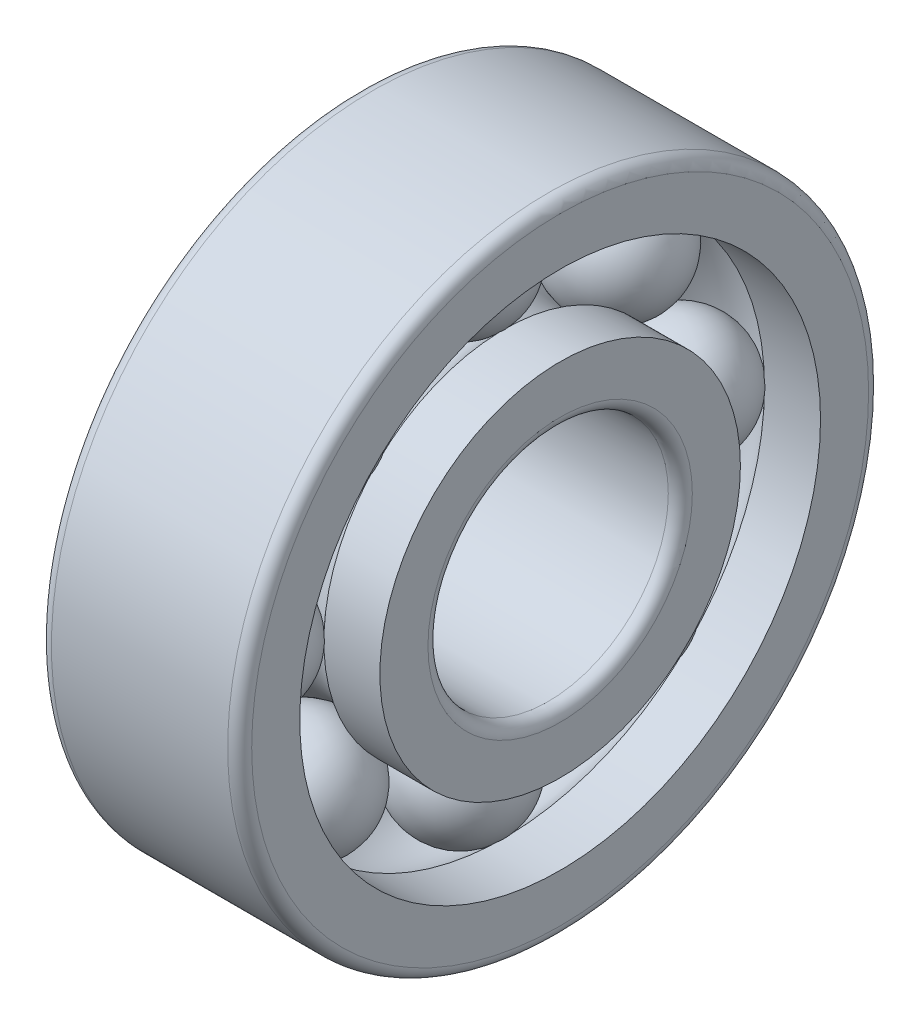
ISO-10303-21;
HEADER;
FILE_DESCRIPTION(('STEP AP214'),'2;1');
FILE_NAME('part.step','',(''),(''),'','','');
FILE_SCHEMA(('AUTOMOTIVE_DESIGN { 1 0 10303 214 1 1 1 1 }'));
ENDSEC;
DATA;
#1=APPLICATION_CONTEXT('core data for automotive mechanical design processes');
#2=APPLICATION_PROTOCOL_DEFINITION('international standard','automotive_design',2000,#1);
#3=PRODUCT_CONTEXT('',#1,'mechanical');
#4=PRODUCT('Part','Part','',(#3));
#5=PRODUCT_RELATED_PRODUCT_CATEGORY('part','',(#4));
#6=PRODUCT_DEFINITION_FORMATION('','',#4);
#7=PRODUCT_DEFINITION_CONTEXT('part definition',#1,'design');
#8=PRODUCT_DEFINITION('design','',#6,#7);
#9=PRODUCT_DEFINITION_SHAPE('','',#8);
#10=(LENGTH_UNIT() NAMED_UNIT(*) SI_UNIT(.MILLI.,.METRE.));
#11=(NAMED_UNIT(*) PLANE_ANGLE_UNIT() SI_UNIT($,.RADIAN.));
#12=(NAMED_UNIT(*) SI_UNIT($,.STERADIAN.) SOLID_ANGLE_UNIT());
#13=UNCERTAINTY_MEASURE_WITH_UNIT(LENGTH_MEASURE(1.E-05),#10,'distance_accuracy_value','');
#14=(GEOMETRIC_REPRESENTATION_CONTEXT(3) GLOBAL_UNCERTAINTY_ASSIGNED_CONTEXT((#13)) GLOBAL_UNIT_ASSIGNED_CONTEXT((#10,
#11,#12)) REPRESENTATION_CONTEXT('',''));
#15=CARTESIAN_POINT('',(0.,0.,0.));
#16=DIRECTION('',(0.,0.,1.));
#17=DIRECTION('',(1.,0.,0.));
#18=AXIS2_PLACEMENT_3D('',#15,#16,#17);
#19=CARTESIAN_POINT('',(0.,7.77817459305212,-7.77817459305193));
#20=DIRECTION('',(1.,0.,0.));
#21=DIRECTION('',(0.,-0.707106781186556,0.707106781186539));
#22=AXIS2_PLACEMENT_3D('',#19,#20,#21);
#23=SPHERICAL_SURFACE('',#22,3.);
#24=CARTESIAN_POINT('',(3.,7.77817459305212,-7.77817459305193));
#25=VERTEX_POINT('',#24);
#26=VERTEX_LOOP('',#25);
#27=FACE_BOUND('',#26,.T.);
#28=ADVANCED_FACE('F37',(#27),#23,.T.);
#29=CLOSED_SHELL('',(#28));
#30=MANIFOLD_SOLID_BREP('B2',#29);
#31=CARTESIAN_POINT('',(0.,1.1521895091661E-13,-11.0000000000001));
#32=DIRECTION('',(1.,0.,0.));
#33=DIRECTION('',(0.,0.,1.));
#34=AXIS2_PLACEMENT_3D('',#31,#32,#33);
#35=SPHERICAL_SURFACE('',#34,3.);
#36=CARTESIAN_POINT('',(3.,1.1521895091661E-13,-11.0000000000001));
#37=VERTEX_POINT('',#36);
#38=VERTEX_LOOP('',#37);
#39=FACE_BOUND('',#38,.T.);
#40=ADVANCED_FACE('F55',(#39),#35,.T.);
#41=CLOSED_SHELL('',(#40));
#42=MANIFOLD_SOLID_BREP('B6',#41);
#43=CARTESIAN_POINT('',(0.,-7.77817459305195,-7.77817459305209));
#44=DIRECTION('',(1.,0.,0.));
#45=DIRECTION('',(0.,0.707106781186541,0.707106781186554));
#46=AXIS2_PLACEMENT_3D('',#43,#44,#45);
#47=SPHERICAL_SURFACE('',#46,3.);
#48=CARTESIAN_POINT('',(3.,-7.77817459305195,-7.77817459305209));
#49=VERTEX_POINT('',#48);
#50=VERTEX_LOOP('',#49);
#51=FACE_BOUND('',#50,.T.);
#52=ADVANCED_FACE('F73',(#51),#47,.T.);
#53=CLOSED_SHELL('',(#52));
#54=MANIFOLD_SOLID_BREP('B33',#53);
#55=CARTESIAN_POINT('',(0.,-11.,0.));
#56=DIRECTION('',(1.,0.,0.));
#57=DIRECTION('',(0.,1.,0.));
#58=AXIS2_PLACEMENT_3D('',#55,#56,#57);
#59=SPHERICAL_SURFACE('',#58,3.);
#60=CARTESIAN_POINT('',(3.,-11.,0.));
#61=VERTEX_POINT('',#60);
#62=VERTEX_LOOP('',#61);
#63=FACE_BOUND('',#62,.T.);
#64=ADVANCED_FACE('F91',(#63),#59,.T.);
#65=CLOSED_SHELL('',(#64));
#66=MANIFOLD_SOLID_BREP('B51',#65);
#67=CARTESIAN_POINT('',(0.,-7.77817459305206,7.77817459305198));
#68=DIRECTION('',(1.,0.,0.));
#69=DIRECTION('',(0.,0.707106781186551,-0.707106781186544));
#70=AXIS2_PLACEMENT_3D('',#67,#68,#69);
#71=SPHERICAL_SURFACE('',#70,3.);
#72=CARTESIAN_POINT('',(3.,-7.77817459305206,7.77817459305198));
#73=VERTEX_POINT('',#72);
#74=VERTEX_LOOP('',#73);
#75=FACE_BOUND('',#74,.T.);
#76=ADVANCED_FACE('F109',(#75),#71,.T.);
#77=CLOSED_SHELL('',(#76));
#78=MANIFOLD_SOLID_BREP('B69',#77);
#79=CARTESIAN_POINT('',(0.,0.,10.9999999999999));
#80=DIRECTION('',(1.,0.,0.));
#81=DIRECTION('',(0.,0.,-1.));
#82=AXIS2_PLACEMENT_3D('',#79,#80,#81);
#83=SPHERICAL_SURFACE('',#82,3.);
#84=CARTESIAN_POINT('',(3.,0.,10.9999999999999));
#85=VERTEX_POINT('',#84);
#86=VERTEX_LOOP('',#85);
#87=FACE_BOUND('',#86,.T.);
#88=ADVANCED_FACE('F127',(#87),#83,.T.);
#89=CLOSED_SHELL('',(#88));
#90=MANIFOLD_SOLID_BREP('B87',#89);
#91=CARTESIAN_POINT('',(0.,7.77817459305201,7.77817459305204));
#92=DIRECTION('',(1.,0.,0.));
#93=DIRECTION('',(0.,-0.707106781186546,-0.707106781186549));
#94=AXIS2_PLACEMENT_3D('',#91,#92,#93);
#95=SPHERICAL_SURFACE('',#94,3.);
#96=CARTESIAN_POINT('',(3.,7.77817459305201,7.77817459305204));
#97=VERTEX_POINT('',#96);
#98=VERTEX_LOOP('',#97);
#99=FACE_BOUND('',#98,.T.);
#100=ADVANCED_FACE('F147',(#99),#95,.T.);
#101=CLOSED_SHELL('',(#100));
#102=MANIFOLD_SOLID_BREP('B105',#101);
#103=CARTESIAN_POINT('',(0.,0.,0.));
#104=DIRECTION('',(1.,0.,0.));
#105=DIRECTION('',(0.,0.,-1.));
#106=AXIS2_PLACEMENT_3D('',#103,#104,#105);
#107=TOROIDAL_SURFACE('',#106,11.,2.975);
#108=CARTESIAN_POINT('',(2.2024134489237,0.,0.));
#109=DIRECTION('',(1.,0.,0.));
#110=DIRECTION('',(0.,0.,-1.));
#111=AXIS2_PLACEMENT_3D('',#108,#109,#110);
#112=CIRCLE('',#111,13.);
#113=CARTESIAN_POINT('',(2.2024134489237,0.,-13.));
#114=VERTEX_POINT('',#113);
#115=EDGE_CURVE('E146',#114,#114,#112,.T.);
#116=ORIENTED_EDGE('',*,*,#115,.T.);
#117=EDGE_LOOP('',(#116));
#118=FACE_BOUND('',#117,.T.);
#119=CARTESIAN_POINT('',(-2.2024134489237,0.,0.));
#120=DIRECTION('',(1.,0.,0.));
#121=DIRECTION('',(0.,0.,-1.));
#122=AXIS2_PLACEMENT_3D('',#119,#120,#121);
#123=CIRCLE('',#122,13.);
#124=CARTESIAN_POINT('',(-2.2024134489237,0.,-13.));
#125=VERTEX_POINT('',#124);
#126=EDGE_CURVE('E195',#125,#125,#123,.T.);
#127=ORIENTED_EDGE('',*,*,#126,.F.);
#128=EDGE_LOOP('',(#127));
#129=FACE_BOUND('',#128,.T.);
#130=ADVANCED_FACE('F167',(#118,#129),#107,.F.);
#131=CARTESIAN_POINT('',(-20.6375,0.,0.));
#132=DIRECTION('',(1.,0.,0.));
#133=DIRECTION('',(0.,0.,-1.));
#134=AXIS2_PLACEMENT_3D('',#131,#132,#133);
#135=CYLINDRICAL_SURFACE('',#134,13.);
#136=CARTESIAN_POINT('',(5.,0.,0.));
#137=DIRECTION('',(1.,0.,0.));
#138=DIRECTION('',(0.,0.,-1.));
#139=AXIS2_PLACEMENT_3D('',#136,#137,#138);
#140=CIRCLE('',#139,13.);
#141=CARTESIAN_POINT('',(5.,0.,-13.));
#142=VERTEX_POINT('',#141);
#143=EDGE_CURVE('E173',#142,#142,#140,.T.);
#144=ORIENTED_EDGE('',*,*,#143,.T.);
#145=EDGE_LOOP('',(#144));
#146=FACE_BOUND('',#145,.T.);
#147=ORIENTED_EDGE('',*,*,#115,.F.);
#148=EDGE_LOOP('',(#147));
#149=FACE_BOUND('',#148,.T.);
#150=ADVANCED_FACE('F203',(#146,#149),#135,.F.);
#151=CARTESIAN_POINT('',(5.,15.4,0.));
#152=DIRECTION('',(1.,0.,0.));
#153=DIRECTION('',(0.,0.,-1.));
#154=AXIS2_PLACEMENT_3D('',#151,#152,#153);
#155=PLANE('',#154);
#156=CARTESIAN_POINT('',(5.,0.,0.));
#157=DIRECTION('',(1.,0.,0.));
#158=DIRECTION('',(0.,0.,-1.));
#159=AXIS2_PLACEMENT_3D('',#156,#157,#158);
#160=CIRCLE('',#159,15.4);
#161=CARTESIAN_POINT('',(5.,0.,-15.4));
#162=VERTEX_POINT('',#161);
#163=EDGE_CURVE('E177',#162,#162,#160,.T.);
#164=ORIENTED_EDGE('',*,*,#163,.T.);
#165=EDGE_LOOP('',(#164));
#166=FACE_BOUND('',#165,.T.);
#167=ORIENTED_EDGE('',*,*,#143,.F.);
#168=EDGE_LOOP('',(#167));
#169=FACE_BOUND('',#168,.T.);
#170=ADVANCED_FACE('F207',(#166,#169),#155,.T.);
#171=CARTESIAN_POINT('',(4.4,0.,0.));
#172=DIRECTION('',(1.,0.,0.));
#173=DIRECTION('',(0.,0.,-1.));
#174=AXIS2_PLACEMENT_3D('',#171,#172,#173);
#175=TOROIDAL_SURFACE('',#174,15.4,0.599999999999999);
#176=CARTESIAN_POINT('',(4.4,0.,0.));
#177=DIRECTION('',(1.,0.,0.));
#178=DIRECTION('',(0.,0.,-1.));
#179=AXIS2_PLACEMENT_3D('',#176,#177,#178);
#180=CIRCLE('',#179,16.);
#181=CARTESIAN_POINT('',(4.4,0.,-16.));
#182=VERTEX_POINT('',#181);
#183=EDGE_CURVE('E181',#182,#182,#180,.T.);
#184=ORIENTED_EDGE('',*,*,#183,.T.);
#185=EDGE_LOOP('',(#184));
#186=FACE_BOUND('',#185,.T.);
#187=ORIENTED_EDGE('',*,*,#163,.F.);
#188=EDGE_LOOP('',(#187));
#189=FACE_BOUND('',#188,.T.);
#190=ADVANCED_FACE('F211',(#186,#189),#175,.T.);
#191=CARTESIAN_POINT('',(-20.6375,0.,0.));
#192=DIRECTION('',(1.,0.,0.));
#193=DIRECTION('',(0.,0.,-1.));
#194=AXIS2_PLACEMENT_3D('',#191,#192,#193);
#195=CYLINDRICAL_SURFACE('',#194,16.);
#196=CARTESIAN_POINT('',(-4.4,0.,0.));
#197=DIRECTION('',(1.,0.,0.));
#198=DIRECTION('',(0.,0.,-1.));
#199=AXIS2_PLACEMENT_3D('',#196,#197,#198);
#200=CIRCLE('',#199,16.);
#201=CARTESIAN_POINT('',(-4.4,0.,-16.));
#202=VERTEX_POINT('',#201);
#203=EDGE_CURVE('E186',#202,#202,#200,.T.);
#204=ORIENTED_EDGE('',*,*,#203,.T.);
#205=EDGE_LOOP('',(#204));
#206=FACE_BOUND('',#205,.T.);
#207=ORIENTED_EDGE('',*,*,#183,.F.);
#208=EDGE_LOOP('',(#207));
#209=FACE_BOUND('',#208,.T.);
#210=ADVANCED_FACE('F218',(#206,#209),#195,.T.);
#211=CARTESIAN_POINT('',(-4.4,0.,0.));
#212=DIRECTION('',(1.,0.,0.));
#213=DIRECTION('',(0.,0.,-1.));
#214=AXIS2_PLACEMENT_3D('',#211,#212,#213);
#215=TOROIDAL_SURFACE('',#214,15.4,0.599999999999999);
#216=CARTESIAN_POINT('',(-5.,0.,0.));
#217=DIRECTION('',(1.,0.,0.));
#218=DIRECTION('',(0.,0.,-1.));
#219=AXIS2_PLACEMENT_3D('',#216,#217,#218);
#220=CIRCLE('',#219,15.4);
#221=CARTESIAN_POINT('',(-5.,0.,-15.4));
#222=VERTEX_POINT('',#221);
#223=EDGE_CURVE('E189',#222,#222,#220,.T.);
#224=ORIENTED_EDGE('',*,*,#223,.T.);
#225=EDGE_LOOP('',(#224));
#226=FACE_BOUND('',#225,.T.);
#227=ORIENTED_EDGE('',*,*,#203,.F.);
#228=EDGE_LOOP('',(#227));
#229=FACE_BOUND('',#228,.T.);
#230=ADVANCED_FACE('F222',(#226,#229),#215,.T.);
#231=CARTESIAN_POINT('',(-5.,13.,0.));
#232=DIRECTION('',(-1.,0.,0.));
#233=DIRECTION('',(0.,0.,1.));
#234=AXIS2_PLACEMENT_3D('',#231,#232,#233);
#235=PLANE('',#234);
#236=CARTESIAN_POINT('',(-5.,0.,0.));
#237=DIRECTION('',(1.,0.,0.));
#238=DIRECTION('',(0.,0.,-1.));
#239=AXIS2_PLACEMENT_3D('',#236,#237,#238);
#240=CIRCLE('',#239,13.);
#241=CARTESIAN_POINT('',(-5.,0.,-13.));
#242=VERTEX_POINT('',#241);
#243=EDGE_CURVE('E192',#242,#242,#240,.T.);
#244=ORIENTED_EDGE('',*,*,#243,.T.);
#245=EDGE_LOOP('',(#244));
#246=FACE_BOUND('',#245,.T.);
#247=ORIENTED_EDGE('',*,*,#223,.F.);
#248=EDGE_LOOP('',(#247));
#249=FACE_BOUND('',#248,.T.);
#250=ADVANCED_FACE('F226',(#246,#249),#235,.T.);
#251=CARTESIAN_POINT('',(-20.6375,0.,0.));
#252=DIRECTION('',(1.,0.,0.));
#253=DIRECTION('',(0.,0.,-1.));
#254=AXIS2_PLACEMENT_3D('',#251,#252,#253);
#255=CYLINDRICAL_SURFACE('',#254,13.);
#256=ORIENTED_EDGE('',*,*,#126,.T.);
#257=EDGE_LOOP('',(#256));
#258=FACE_BOUND('',#257,.T.);
#259=ORIENTED_EDGE('',*,*,#243,.F.);
#260=EDGE_LOOP('',(#259));
#261=FACE_BOUND('',#260,.T.);
#262=ADVANCED_FACE('F199',(#258,#261),#255,.F.);
#263=CLOSED_SHELL('',(#130,#150,#170,#190,#210,#230,#250,#262));
#264=MANIFOLD_SOLID_BREP('B123',#263);
#265=CARTESIAN_POINT('',(0.,0.,0.));
#266=DIRECTION('',(1.,0.,0.));
#267=DIRECTION('',(0.,0.,-1.));
#268=AXIS2_PLACEMENT_3D('',#265,#266,#267);
#269=TOROIDAL_SURFACE('',#268,11.,2.975);
#270=CARTESIAN_POINT('',(-2.2024134489237,0.,0.));
#271=DIRECTION('',(1.,0.,0.));
#272=DIRECTION('',(0.,0.,-1.));
#273=AXIS2_PLACEMENT_3D('',#270,#271,#272);
#274=CIRCLE('',#273,9.);
#275=CARTESIAN_POINT('',(-2.2024134489237,0.,-9.));
#276=VERTEX_POINT('',#275);
#277=EDGE_CURVE('E321',#276,#276,#274,.T.);
#278=ORIENTED_EDGE('',*,*,#277,.T.);
#279=EDGE_LOOP('',(#278));
#280=FACE_BOUND('',#279,.T.);
#281=CARTESIAN_POINT('',(2.2024134489237,0.,0.));
#282=DIRECTION('',(1.,0.,0.));
#283=DIRECTION('',(0.,0.,-1.));
#284=AXIS2_PLACEMENT_3D('',#281,#282,#283);
#285=CIRCLE('',#284,9.);
#286=CARTESIAN_POINT('',(2.2024134489237,0.,-9.));
#287=VERTEX_POINT('',#286);
#288=EDGE_CURVE('E166',#287,#287,#285,.T.);
#289=ORIENTED_EDGE('',*,*,#288,.F.);
#290=EDGE_LOOP('',(#289));
#291=FACE_BOUND('',#290,.T.);
#292=ADVANCED_FACE('F293',(#280,#291),#269,.F.);
#293=CARTESIAN_POINT('',(-20.6375,0.,0.));
#294=DIRECTION('',(1.,0.,0.));
#295=DIRECTION('',(0.,0.,-1.));
#296=AXIS2_PLACEMENT_3D('',#293,#294,#295);
#297=CYLINDRICAL_SURFACE('',#296,9.);
#298=ORIENTED_EDGE('',*,*,#288,.T.);
#299=EDGE_LOOP('',(#298));
#300=FACE_BOUND('',#299,.T.);
#301=CARTESIAN_POINT('',(5.,0.,0.));
#302=DIRECTION('',(1.,0.,0.));
#303=DIRECTION('',(0.,0.,-1.));
#304=AXIS2_PLACEMENT_3D('',#301,#302,#303);
#305=CIRCLE('',#304,9.);
#306=CARTESIAN_POINT('',(5.,0.,-9.));
#307=VERTEX_POINT('',#306);
#308=EDGE_CURVE('E299',#307,#307,#305,.T.);
#309=ORIENTED_EDGE('',*,*,#308,.F.);
#310=EDGE_LOOP('',(#309));
#311=FACE_BOUND('',#310,.T.);
#312=ADVANCED_FACE('F339',(#300,#311),#297,.T.);
#313=CARTESIAN_POINT('',(5.,6.6,0.));
#314=DIRECTION('',(1.,0.,0.));
#315=DIRECTION('',(0.,0.,-1.));
#316=AXIS2_PLACEMENT_3D('',#313,#314,#315);
#317=PLANE('',#316);
#318=ORIENTED_EDGE('',*,*,#308,.T.);
#319=EDGE_LOOP('',(#318));
#320=FACE_BOUND('',#319,.T.);
#321=CARTESIAN_POINT('',(5.,0.,0.));
#322=DIRECTION('',(1.,0.,0.));
#323=DIRECTION('',(0.,0.,-1.));
#324=AXIS2_PLACEMENT_3D('',#321,#322,#323);
#325=CIRCLE('',#324,6.6);
#326=CARTESIAN_POINT('',(5.,0.,-6.6));
#327=VERTEX_POINT('',#326);
#328=EDGE_CURVE('E303',#327,#327,#325,.T.);
#329=ORIENTED_EDGE('',*,*,#328,.F.);
#330=EDGE_LOOP('',(#329));
#331=FACE_BOUND('',#330,.T.);
#332=ADVANCED_FACE('F343',(#320,#331),#317,.T.);
#333=CARTESIAN_POINT('',(4.4,0.,0.));
#334=DIRECTION('',(1.,0.,0.));
#335=DIRECTION('',(0.,0.,-1.));
#336=AXIS2_PLACEMENT_3D('',#333,#334,#335);
#337=TOROIDAL_SURFACE('',#336,6.6,0.6);
#338=ORIENTED_EDGE('',*,*,#328,.T.);
#339=EDGE_LOOP('',(#338));
#340=FACE_BOUND('',#339,.T.);
#341=CARTESIAN_POINT('',(4.4,0.,0.));
#342=DIRECTION('',(1.,0.,0.));
#343=DIRECTION('',(0.,0.,-1.));
#344=AXIS2_PLACEMENT_3D('',#341,#342,#343);
#345=CIRCLE('',#344,6.);
#346=CARTESIAN_POINT('',(4.4,0.,-6.));
#347=VERTEX_POINT('',#346);
#348=EDGE_CURVE('E307',#347,#347,#345,.T.);
#349=ORIENTED_EDGE('',*,*,#348,.F.);
#350=EDGE_LOOP('',(#349));
#351=FACE_BOUND('',#350,.T.);
#352=ADVANCED_FACE('F347',(#340,#351),#337,.T.);
#353=CARTESIAN_POINT('',(-20.6375,0.,0.));
#354=DIRECTION('',(1.,0.,0.));
#355=DIRECTION('',(0.,0.,-1.));
#356=AXIS2_PLACEMENT_3D('',#353,#354,#355);
#357=CYLINDRICAL_SURFACE('',#356,6.);
#358=ORIENTED_EDGE('',*,*,#348,.T.);
#359=EDGE_LOOP('',(#358));
#360=FACE_BOUND('',#359,.T.);
#361=CARTESIAN_POINT('',(-4.4,0.,0.));
#362=DIRECTION('',(1.,0.,0.));
#363=DIRECTION('',(0.,0.,-1.));
#364=AXIS2_PLACEMENT_3D('',#361,#362,#363);
#365=CIRCLE('',#364,6.);
#366=CARTESIAN_POINT('',(-4.4,0.,-6.));
#367=VERTEX_POINT('',#366);
#368=EDGE_CURVE('E312',#367,#367,#365,.T.);
#369=ORIENTED_EDGE('',*,*,#368,.F.);
#370=EDGE_LOOP('',(#369));
#371=FACE_BOUND('',#370,.T.);
#372=ADVANCED_FACE('F353',(#360,#371),#357,.F.);
#373=CARTESIAN_POINT('',(-4.4,0.,0.));
#374=DIRECTION('',(1.,0.,0.));
#375=DIRECTION('',(0.,0.,-1.));
#376=AXIS2_PLACEMENT_3D('',#373,#374,#375);
#377=TOROIDAL_SURFACE('',#376,6.6,0.6);
#378=ORIENTED_EDGE('',*,*,#368,.T.);
#379=EDGE_LOOP('',(#378));
#380=FACE_BOUND('',#379,.T.);
#381=CARTESIAN_POINT('',(-5.,0.,0.));
#382=DIRECTION('',(1.,0.,0.));
#383=DIRECTION('',(0.,0.,-1.));
#384=AXIS2_PLACEMENT_3D('',#381,#382,#383);
#385=CIRCLE('',#384,6.6);
#386=CARTESIAN_POINT('',(-5.,0.,-6.6));
#387=VERTEX_POINT('',#386);
#388=EDGE_CURVE('E315',#387,#387,#385,.T.);
#389=ORIENTED_EDGE('',*,*,#388,.F.);
#390=EDGE_LOOP('',(#389));
#391=FACE_BOUND('',#390,.T.);
#392=ADVANCED_FACE('F335',(#380,#391),#377,.T.);
#393=CARTESIAN_POINT('',(-5.,9.,0.));
#394=DIRECTION('',(-1.,0.,0.));
#395=DIRECTION('',(0.,0.,1.));
#396=AXIS2_PLACEMENT_3D('',#393,#394,#395);
#397=PLANE('',#396);
#398=ORIENTED_EDGE('',*,*,#388,.T.);
#399=EDGE_LOOP('',(#398));
#400=FACE_BOUND('',#399,.T.);
#401=CARTESIAN_POINT('',(-5.,0.,0.));
#402=DIRECTION('',(1.,0.,0.));
#403=DIRECTION('',(0.,0.,-1.));
#404=AXIS2_PLACEMENT_3D('',#401,#402,#403);
#405=CIRCLE('',#404,9.);
#406=CARTESIAN_POINT('',(-5.,0.,-9.));
#407=VERTEX_POINT('',#406);
#408=EDGE_CURVE('E318',#407,#407,#405,.T.);
#409=ORIENTED_EDGE('',*,*,#408,.F.);
#410=EDGE_LOOP('',(#409));
#411=FACE_BOUND('',#410,.T.);
#412=ADVANCED_FACE('F329',(#400,#411),#397,.T.);
#413=CARTESIAN_POINT('',(-20.6375,0.,0.));
#414=DIRECTION('',(1.,0.,0.));
#415=DIRECTION('',(0.,0.,-1.));
#416=AXIS2_PLACEMENT_3D('',#413,#414,#415);
#417=CYLINDRICAL_SURFACE('',#416,9.);
#418=ORIENTED_EDGE('',*,*,#408,.T.);
#419=EDGE_LOOP('',(#418));
#420=FACE_BOUND('',#419,.T.);
#421=ORIENTED_EDGE('',*,*,#277,.F.);
#422=EDGE_LOOP('',(#421));
#423=FACE_BOUND('',#422,.T.);
#424=ADVANCED_FACE('F327',(#420,#423),#417,.T.);
#425=CLOSED_SHELL('',(#292,#312,#332,#352,#372,#392,#412,#424));
#426=MANIFOLD_SOLID_BREP('B141',#425);
#427=CARTESIAN_POINT('',(0.,11.,0.));
#428=DIRECTION('',(1.,0.,0.));
#429=DIRECTION('',(0.,-1.,0.));
#430=AXIS2_PLACEMENT_3D('',#427,#428,#429);
#431=SPHERICAL_SURFACE('',#430,3.);
#432=CARTESIAN_POINT('',(3.,11.,0.));
#433=VERTEX_POINT('',#432);
#434=VERTEX_LOOP('',#433);
#435=FACE_BOUND('',#434,.T.);
#436=ADVANCED_FACE('F414',(#435),#431,.T.);
#437=CLOSED_SHELL('',(#436));
#438=MANIFOLD_SOLID_BREP('B161',#437);
#439=ADVANCED_BREP_SHAPE_REPRESENTATION('',(#18,#30,#42,#54,#66,#78,#90,#102,#264,#426,#438),#14);
#440=SHAPE_DEFINITION_REPRESENTATION(#9,#439);
ENDSEC;
END-ISO-10303-21;
